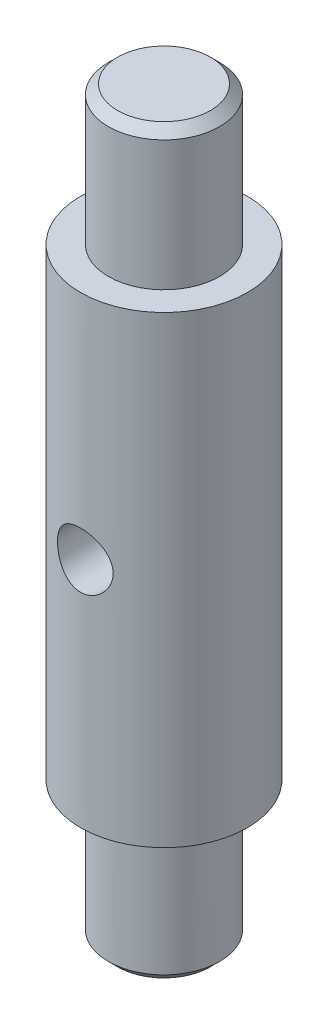
ISO-10303-21;
HEADER;
FILE_DESCRIPTION(('STEP AP214'),'2;1');
FILE_NAME('part.step','',(''),(''),'','','');
FILE_SCHEMA(('AUTOMOTIVE_DESIGN { 1 0 10303 214 1 1 1 1 }'));
ENDSEC;
DATA;
#1=APPLICATION_CONTEXT('core data for automotive mechanical design processes');
#2=APPLICATION_PROTOCOL_DEFINITION('international standard','automotive_design',2000,#1);
#3=PRODUCT_CONTEXT('',#1,'mechanical');
#4=PRODUCT('Part','Part','',(#3));
#5=PRODUCT_RELATED_PRODUCT_CATEGORY('part','',(#4));
#6=PRODUCT_DEFINITION_FORMATION('','',#4);
#7=PRODUCT_DEFINITION_CONTEXT('part definition',#1,'design');
#8=PRODUCT_DEFINITION('design','',#6,#7);
#9=PRODUCT_DEFINITION_SHAPE('','',#8);
#10=(LENGTH_UNIT() NAMED_UNIT(*) SI_UNIT(.MILLI.,.METRE.));
#11=(NAMED_UNIT(*) PLANE_ANGLE_UNIT() SI_UNIT($,.RADIAN.));
#12=(NAMED_UNIT(*) SI_UNIT($,.STERADIAN.) SOLID_ANGLE_UNIT());
#13=UNCERTAINTY_MEASURE_WITH_UNIT(LENGTH_MEASURE(1.E-05),#10,'distance_accuracy_value','');
#14=(GEOMETRIC_REPRESENTATION_CONTEXT(3) GLOBAL_UNCERTAINTY_ASSIGNED_CONTEXT((#13)) GLOBAL_UNIT_ASSIGNED_CONTEXT((#10,
#11,#12)) REPRESENTATION_CONTEXT('',''));
#15=CARTESIAN_POINT('',(0.,0.,0.));
#16=DIRECTION('',(0.,0.,1.));
#17=DIRECTION('',(1.,0.,0.));
#18=AXIS2_PLACEMENT_3D('',#15,#16,#17);
#19=CARTESIAN_POINT('',(6.,40.,-9.));
#20=DIRECTION('',(0.,0.,1.));
#21=DIRECTION('',(1.,0.,0.));
#22=AXIS2_PLACEMENT_3D('',#19,#20,#21);
#23=CYLINDRICAL_SURFACE('',#22,3.);
#24=CARTESIAN_POINT('',(6.,37.,9.));
#25=CARTESIAN_POINT('',(6.16369008866017,36.9999992388051,9.00000045902832));
#26=CARTESIAN_POINT('',(6.32737558361565,37.0134407983816,8.99549308522634));
#27=CARTESIAN_POINT('',(6.64992528261892,37.0666873264516,8.97795630609842));
#28=CARTESIAN_POINT('',(6.80878898435645,37.1064950318468,8.96492601606458));
#29=CARTESIAN_POINT('',(7.11699836850533,37.2109577301521,8.93175923719328));
#30=CARTESIAN_POINT('',(7.2663594776581,37.2755711873778,8.9116346319256));
#31=CARTESIAN_POINT('',(7.55212481041597,37.427623518515,8.86633337152026));
#32=CARTESIAN_POINT('',(7.68852647087612,37.5150668950078,8.84115572003334));
#33=CARTESIAN_POINT('',(7.9492250250668,37.7134774145763,8.78742283329015));
#34=CARTESIAN_POINT('',(8.07301110089492,37.8250937027815,8.75878669391355));
#35=CARTESIAN_POINT('',(8.30049807810625,38.0673014641197,8.70180944349365));
#36=CARTESIAN_POINT('',(8.40419455646838,38.1978971047855,8.67346839871647));
#37=CARTESIAN_POINT('',(8.59147482668358,38.4789553455894,8.61939997431822));
#38=CARTESIAN_POINT('',(8.6743945746631,38.6298812191964,8.59377117827064));
#39=CARTESIAN_POINT('',(8.81345662163316,38.9445282833756,8.54925916255803));
#40=CARTESIAN_POINT('',(8.8696070921603,39.1082455514882,8.53037388482237));
#41=CARTESIAN_POINT('',(8.95162038452749,39.4380196644901,8.50233909808132));
#42=CARTESIAN_POINT('',(8.97844034481531,39.6038116254672,8.49288287308834));
#43=CARTESIAN_POINT('',(9.00402337000343,39.9377912624676,8.48386969888523));
#44=CARTESIAN_POINT('',(9.00279510481416,40.1059781821276,8.4843096906819));
#45=CARTESIAN_POINT('',(8.97305971111026,40.4318098913321,8.49477045024541));
#46=CARTESIAN_POINT('',(8.94580173950099,40.5895852087571,8.50435247602599));
#47=CARTESIAN_POINT('',(8.86681848854825,40.8981802588205,8.53129973173653));
#48=CARTESIAN_POINT('',(8.81509027977562,41.0489991563052,8.54866589352323));
#49=CARTESIAN_POINT('',(8.68781717418064,41.3422382487744,8.58953733393746));
#50=CARTESIAN_POINT('',(8.61190214612179,41.4844840764086,8.61313697379352));
#51=CARTESIAN_POINT('',(8.43866731890942,41.7546127248392,8.66377675727179));
#52=CARTESIAN_POINT('',(8.34134133709202,41.8824913808001,8.69081789371391));
#53=CARTESIAN_POINT('',(8.12204799804671,42.1272747944823,8.74701987503223));
#54=CARTESIAN_POINT('',(7.99905945022893,42.2432580835272,8.77621768064529));
#55=CARTESIAN_POINT('',(7.73501870991019,42.4531937999902,8.8322081516111));
#56=CARTESIAN_POINT('',(7.59396478698245,42.5471441144935,8.85900058614202));
#57=CARTESIAN_POINT('',(7.29584283913881,42.7110889007052,8.90751323813381));
#58=CARTESIAN_POINT('',(7.13862982924901,42.7808364740222,8.92918050024118));
#59=CARTESIAN_POINT('',(6.81380725009352,42.8926095218671,8.96461701433305));
#60=CARTESIAN_POINT('',(6.64620131446486,42.9346446262703,8.97838900964638));
#61=CARTESIAN_POINT('',(6.31315148858791,42.9881669980671,8.99602881214321));
#62=CARTESIAN_POINT('',(6.14792879959454,43.0008994275183,9.00030005501184));
#63=CARTESIAN_POINT('',(5.81767479011929,42.9990019792046,8.99966708084482));
#64=CARTESIAN_POINT('',(5.65264344204105,42.9843767200604,8.99476441258087));
#65=CARTESIAN_POINT('',(5.33244040108723,42.9291642767921,8.97660074151313));
#66=CARTESIAN_POINT('',(5.17712157949547,42.8893413818515,8.96358596133577));
#67=CARTESIAN_POINT('',(4.87543212426128,42.7858196665998,8.9307554049021));
#68=CARTESIAN_POINT('',(4.72906263447418,42.7221178015966,8.91093876140025));
#69=CARTESIAN_POINT('',(4.44513511082018,42.5707887044776,8.86586793861869));
#70=CARTESIAN_POINT('',(4.30791012234856,42.4825762201505,8.84048444267358));
#71=CARTESIAN_POINT('',(4.04980550959324,42.2854175499596,8.78715761748787));
#72=CARTESIAN_POINT('',(3.92893089661327,42.1764650319047,8.75921350781483));
#73=CARTESIAN_POINT('',(3.7012424765811,41.9350637469802,8.70230543941334));
#74=CARTESIAN_POINT('',(3.59531709226269,41.8017723192194,8.67335283262284));
#75=CARTESIAN_POINT('',(3.40722743302928,41.5186852965673,8.61899919884126));
#76=CARTESIAN_POINT('',(3.32506335620696,41.3688895640978,8.59359820146007));
#77=CARTESIAN_POINT('',(3.18720920875091,41.0569809541303,8.54947175374151));
#78=CARTESIAN_POINT('',(3.13146560350493,40.8948937624937,8.53073282378937));
#79=CARTESIAN_POINT('',(3.04831599972193,40.5628640498676,8.50232496919349));
#80=CARTESIAN_POINT('',(3.02089723513818,40.392925103787,8.49265195870918));
#81=CARTESIAN_POINT('',(2.99617115256797,40.0594087118772,8.48393576622531));
#82=CARTESIAN_POINT('',(2.9973892280748,39.8959529791395,8.48437200772245));
#83=CARTESIAN_POINT('',(3.02627311965392,39.5717047752338,8.49453809471602));
#84=CARTESIAN_POINT('',(3.05393736162424,39.4109121461347,8.50426738708085));
#85=CARTESIAN_POINT('',(3.13388456061196,39.0995930109926,8.53153572914675));
#86=CARTESIAN_POINT('',(3.18568996195346,38.9489295249865,8.54892294067433));
#87=CARTESIAN_POINT('',(3.31206190272076,38.6583177791852,8.58949196455406));
#88=CARTESIAN_POINT('',(3.38663349433858,38.518371906436,8.61267506290179));
#89=CARTESIAN_POINT('',(3.56021792224971,38.2465489902313,8.66348487678139));
#90=CARTESIAN_POINT('',(3.66015527170626,38.1152904943048,8.69126134926411));
#91=CARTESIAN_POINT('',(3.88007135059305,37.8709305598474,8.74750068849759));
#92=CARTESIAN_POINT('',(4.00005574664555,37.7578342729358,8.77596374737117));
#93=CARTESIAN_POINT('',(4.26227532923793,37.5485667631325,8.83170091576633));
#94=CARTESIAN_POINT('',(4.40519545950082,37.453226956747,8.8588854540377));
#95=CARTESIAN_POINT('',(4.70592792778013,37.2880287134481,8.90777973517836));
#96=CARTESIAN_POINT('',(4.86373644560295,37.2181637622339,8.9294908772379));
#97=CARTESIAN_POINT('',(5.18251905839707,37.108835102534,8.96416545205626));
#98=CARTESIAN_POINT('',(5.34303672697078,37.0681526012099,8.97747637267568));
#99=CARTESIAN_POINT('',(5.66903875196926,37.0137391579686,8.99539221192665));
#100=CARTESIAN_POINT('',(5.83452172329376,37.0000007695104,8.99999953595715));
#101=CARTESIAN_POINT('',(6.,37.,9.));
#102=B_SPLINE_CURVE_WITH_KNOTS('',3,(#24,#25,#26,#27,#28,#29,#30,#31,#32,#33,#34,#35,#36,#37,
#38,#39,#40,#41,#42,#43,#44,#45,#46,#47,#48,#49,#50,#51,#52,#53,#54,#55,#56,#57,#58,#59,#60,#61,
#62,#63,#64,#65,#66,#67,#68,#69,#70,#71,#72,#73,#74,#75,#76,#77,#78,#79,#80,#81,#82,#83,#84,#85,
#86,#87,#88,#89,#90,#91,#92,#93,#94,#95,#96,#97,#98,#99,#100,#101),.UNSPECIFIED.,.T.,.F.,(4,2,2,
2,2,2,2,2,2,2,2,2,2,2,2,2,2,2,2,2,2,2,2,2,2,2,2,2,2,2,2,2,2,2,2,2,2,2,4),(0.,0.490461318078034,
0.980973555802562,1.47066801861082,1.9604591333973,2.46554052848268,2.97073299862591,
3.49045154470411,4.010011340785,4.5120577722552,5.01394901962457,5.49290479653841,
5.97191792566446,6.45864513465392,6.94551307674622,7.45779917434101,7.97013437899855,
8.48755216951073,9.00479006631625,9.49960749525509,9.9943413949253,10.4747447393464,
10.9552093585231,11.4483119953121,11.9415654246567,12.4572306864226,12.9729002470499,
13.4875204148031,14.0019085411752,14.4898699819278,14.9778023805413,15.4564676124125,
15.9352391452793,16.4349020007541,16.9347063337134,17.453989825053,17.9731404345737,
18.4690967512144,18.9649159811442),.UNSPECIFIED.);
#103=CARTESIAN_POINT('',(6.,37.,9.));
#104=VERTEX_POINT('',#103);
#105=EDGE_CURVE('E139',#104,#104,#102,.T.);
#106=ORIENTED_EDGE('',*,*,#105,.T.);
#107=EDGE_LOOP('',(#106));
#108=FACE_BOUND('',#107,.T.);
#109=CARTESIAN_POINT('',(6.,40.,0.));
#110=DIRECTION('',(0.,0.707106781186547,0.707106781186548));
#111=DIRECTION('',(0.,-0.707106781186547,0.707106781186548));
#112=AXIS2_PLACEMENT_3D('',#109,#110,#111);
#113=ELLIPSE('',#112,4.24264068711929,3.);
#114=CARTESIAN_POINT('',(9.,40.,0.));
#115=VERTEX_POINT('',#114);
#116=CARTESIAN_POINT('',(3.,40.,0.));
#117=VERTEX_POINT('',#116);
#118=EDGE_CURVE('E61',#115,#117,#113,.F.);
#119=ORIENTED_EDGE('',*,*,#118,.T.);
#120=CARTESIAN_POINT('',(6.,40.,0.));
#121=DIRECTION('',(0.,-0.707106781186547,0.707106781186548));
#122=DIRECTION('',(0.,0.707106781186547,0.707106781186548));
#123=AXIS2_PLACEMENT_3D('',#120,#121,#122);
#124=ELLIPSE('',#123,4.24264068711929,3.);
#125=EDGE_CURVE('E69',#117,#115,#124,.F.);
#126=ORIENTED_EDGE('',*,*,#125,.T.);
#127=EDGE_LOOP('',(#119,#126));
#128=FACE_BOUND('',#127,.T.);
#129=ADVANCED_FACE('F46',(#108,#128),#23,.F.);
#130=CARTESIAN_POINT('',(0.,0.,0.));
#131=DIRECTION('',(0.,-1.,0.));
#132=DIRECTION('',(0.,0.,-1.));
#133=AXIS2_PLACEMENT_3D('',#130,#131,#132);
#134=PLANE('',#133);
#135=CARTESIAN_POINT('',(6.,0.,0.));
#136=DIRECTION('',(0.,-1.,0.));
#137=DIRECTION('',(0.,0.,-1.));
#138=AXIS2_PLACEMENT_3D('',#135,#136,#137);
#139=CIRCLE('',#138,5.);
#140=CARTESIAN_POINT('',(6.,0.,-5.));
#141=VERTEX_POINT('',#140);
#142=EDGE_CURVE('E11',#141,#141,#139,.T.);
#143=ORIENTED_EDGE('',*,*,#142,.T.);
#144=EDGE_LOOP('',(#143));
#145=FACE_BOUND('',#144,.T.);
#146=CARTESIAN_POINT('',(6.,0.,0.));
#147=DIRECTION('',(0.,-1.,0.));
#148=DIRECTION('',(0.,0.,-1.));
#149=AXIS2_PLACEMENT_3D('',#146,#147,#148);
#150=CIRCLE('',#149,3.);
#151=CARTESIAN_POINT('',(6.,0.,-3.));
#152=VERTEX_POINT('',#151);
#153=EDGE_CURVE('E166',#152,#152,#150,.T.);
#154=ORIENTED_EDGE('',*,*,#153,.F.);
#155=EDGE_LOOP('',(#154));
#156=FACE_BOUND('',#155,.T.);
#157=ADVANCED_FACE('F104',(#145,#156),#134,.T.);
#158=CARTESIAN_POINT('',(0.,80.,0.));
#159=DIRECTION('',(0.,1.,0.));
#160=DIRECTION('',(0.,0.,1.));
#161=AXIS2_PLACEMENT_3D('',#158,#159,#160);
#162=PLANE('',#161);
#163=CARTESIAN_POINT('',(6.,80.,0.));
#164=DIRECTION('',(0.,1.,0.));
#165=DIRECTION('',(0.,0.,1.));
#166=AXIS2_PLACEMENT_3D('',#163,#164,#165);
#167=CIRCLE('',#166,5.);
#168=CARTESIAN_POINT('',(6.,80.,5.));
#169=VERTEX_POINT('',#168);
#170=EDGE_CURVE('E78',#169,#169,#167,.T.);
#171=ORIENTED_EDGE('',*,*,#170,.T.);
#172=EDGE_LOOP('',(#171));
#173=FACE_BOUND('',#172,.T.);
#174=ADVANCED_FACE('F110',(#173),#162,.T.);
#175=CARTESIAN_POINT('',(6.,80.,0.));
#176=DIRECTION('',(0.,1.,0.));
#177=DIRECTION('',(0.,0.,1.));
#178=AXIS2_PLACEMENT_3D('',#175,#176,#177);
#179=CYLINDRICAL_SURFACE('',#178,6.);
#180=CARTESIAN_POINT('',(6.,79.,0.));
#181=DIRECTION('',(0.,1.,0.));
#182=DIRECTION('',(0.,0.,1.));
#183=AXIS2_PLACEMENT_3D('',#180,#181,#182);
#184=CIRCLE('',#183,6.);
#185=CARTESIAN_POINT('',(6.,79.,6.));
#186=VERTEX_POINT('',#185);
#187=EDGE_CURVE('E86',#186,#186,#184,.F.);
#188=ORIENTED_EDGE('',*,*,#187,.T.);
#189=EDGE_LOOP('',(#188));
#190=FACE_BOUND('',#189,.T.);
#191=CARTESIAN_POINT('',(6.,65.,0.));
#192=DIRECTION('',(0.,1.,0.));
#193=DIRECTION('',(0.,0.,1.));
#194=AXIS2_PLACEMENT_3D('',#191,#192,#193);
#195=CIRCLE('',#194,6.);
#196=CARTESIAN_POINT('',(6.,65.,6.));
#197=VERTEX_POINT('',#196);
#198=EDGE_CURVE('E150',#197,#197,#195,.T.);
#199=ORIENTED_EDGE('',*,*,#198,.T.);
#200=EDGE_LOOP('',(#199));
#201=FACE_BOUND('',#200,.T.);
#202=ADVANCED_FACE('F247',(#190,#201),#179,.T.);
#203=CARTESIAN_POINT('',(-3.,65.,0.));
#204=DIRECTION('',(0.,1.,0.));
#205=DIRECTION('',(0.,0.,1.));
#206=AXIS2_PLACEMENT_3D('',#203,#204,#205);
#207=PLANE('',#206);
#208=CARTESIAN_POINT('',(6.,65.,0.));
#209=DIRECTION('',(0.,1.,0.));
#210=DIRECTION('',(0.,0.,1.));
#211=AXIS2_PLACEMENT_3D('',#208,#209,#210);
#212=CIRCLE('',#211,9.);
#213=CARTESIAN_POINT('',(6.,65.,9.));
#214=VERTEX_POINT('',#213);
#215=EDGE_CURVE('E153',#214,#214,#212,.T.);
#216=ORIENTED_EDGE('',*,*,#215,.T.);
#217=EDGE_LOOP('',(#216));
#218=FACE_BOUND('',#217,.T.);
#219=ORIENTED_EDGE('',*,*,#198,.F.);
#220=EDGE_LOOP('',(#219));
#221=FACE_BOUND('',#220,.T.);
#222=ADVANCED_FACE('F134',(#218,#221),#207,.T.);
#223=CARTESIAN_POINT('',(6.,80.,0.));
#224=DIRECTION('',(0.,1.,0.));
#225=DIRECTION('',(0.,0.,1.));
#226=AXIS2_PLACEMENT_3D('',#223,#224,#225);
#227=CYLINDRICAL_SURFACE('',#226,9.);
#228=CARTESIAN_POINT('',(6.,43.,-9.));
#229=CARTESIAN_POINT('',(6.16369008866017,43.0000007611949,-9.00000045902832));
#230=CARTESIAN_POINT('',(6.32737558361565,42.9865592016184,-8.99549308522634));
#231=CARTESIAN_POINT('',(6.64992528261892,42.9333126735484,-8.97795630609842));
#232=CARTESIAN_POINT('',(6.80878898435645,42.8935049681532,-8.96492601606458));
#233=CARTESIAN_POINT('',(7.11699836850533,42.7890422698479,-8.93175923719328));
#234=CARTESIAN_POINT('',(7.2663594776581,42.7244288126222,-8.9116346319256));
#235=CARTESIAN_POINT('',(7.55212481041597,42.572376481485,-8.86633337152026));
#236=CARTESIAN_POINT('',(7.68852647087612,42.4849331049922,-8.84115572003334));
#237=CARTESIAN_POINT('',(7.9492250250668,42.2865225854237,-8.78742283329015));
#238=CARTESIAN_POINT('',(8.07301110089492,42.1749062972185,-8.75878669391355));
#239=CARTESIAN_POINT('',(8.30049807810625,41.9326985358803,-8.70180944349365));
#240=CARTESIAN_POINT('',(8.40419455646838,41.8021028952145,-8.67346839871647));
#241=CARTESIAN_POINT('',(8.59147482668358,41.5210446544106,-8.61939997431822));
#242=CARTESIAN_POINT('',(8.6743945746631,41.3701187808036,-8.59377117827064));
#243=CARTESIAN_POINT('',(8.81345662163316,41.0554717166244,-8.54925916255803));
#244=CARTESIAN_POINT('',(8.8696070921603,40.8917544485118,-8.53037388482237));
#245=CARTESIAN_POINT('',(8.95162038452749,40.5619803355099,-8.50233909808132));
#246=CARTESIAN_POINT('',(8.97844034481531,40.3961883745328,-8.49288287308834));
#247=CARTESIAN_POINT('',(9.00402337000343,40.0622087375324,-8.48386969888523));
#248=CARTESIAN_POINT('',(9.00279510481416,39.8940218178724,-8.4843096906819));
#249=CARTESIAN_POINT('',(8.97305971111026,39.5681901086679,-8.49477045024541));
#250=CARTESIAN_POINT('',(8.94580173950099,39.4104147912429,-8.50435247602599));
#251=CARTESIAN_POINT('',(8.86681848854825,39.1018197411795,-8.53129973173653));
#252=CARTESIAN_POINT('',(8.81509027977562,38.9510008436948,-8.54866589352323));
#253=CARTESIAN_POINT('',(8.68781717418064,38.6577617512256,-8.58953733393746));
#254=CARTESIAN_POINT('',(8.61190214612179,38.5155159235914,-8.61313697379352));
#255=CARTESIAN_POINT('',(8.43866731890942,38.2453872751608,-8.66377675727179));
#256=CARTESIAN_POINT('',(8.34134133709202,38.1175086191999,-8.69081789371391));
#257=CARTESIAN_POINT('',(8.12204799804671,37.8727252055177,-8.74701987503223));
#258=CARTESIAN_POINT('',(7.99905945022893,37.7567419164728,-8.77621768064529));
#259=CARTESIAN_POINT('',(7.73501870991019,37.5468062000098,-8.8322081516111));
#260=CARTESIAN_POINT('',(7.59396478698245,37.4528558855065,-8.85900058614202));
#261=CARTESIAN_POINT('',(7.29584283913881,37.2889110992948,-8.90751323813381));
#262=CARTESIAN_POINT('',(7.13862982924902,37.2191635259778,-8.92918050024118));
#263=CARTESIAN_POINT('',(6.81380725009353,37.1073904781329,-8.96461701433304));
#264=CARTESIAN_POINT('',(6.64620131446487,37.0653553737297,-8.97838900964638));
#265=CARTESIAN_POINT('',(6.31315148858791,37.0118330019329,-8.99602881214321));
#266=CARTESIAN_POINT('',(6.14792879959454,36.9991005724817,-9.00030005501184));
#267=CARTESIAN_POINT('',(5.81767479011929,37.0009980207954,-8.99966708084482));
#268=CARTESIAN_POINT('',(5.65264344204105,37.0156232799396,-8.99476441258087));
#269=CARTESIAN_POINT('',(5.33244040108723,37.0708357232079,-8.97660074151313));
#270=CARTESIAN_POINT('',(5.17712157949547,37.1106586181485,-8.96358596133577));
#271=CARTESIAN_POINT('',(4.87543212426128,37.2141803334002,-8.9307554049021));
#272=CARTESIAN_POINT('',(4.72906263447418,37.2778821984034,-8.91093876140025));
#273=CARTESIAN_POINT('',(4.44513511082018,37.4292112955224,-8.86586793861869));
#274=CARTESIAN_POINT('',(4.30791012234856,37.5174237798495,-8.84048444267358));
#275=CARTESIAN_POINT('',(4.04980550959324,37.7145824500404,-8.78715761748787));
#276=CARTESIAN_POINT('',(3.92893089661327,37.8235349680953,-8.75921350781483));
#277=CARTESIAN_POINT('',(3.7012424765811,38.0649362530198,-8.70230543941334));
#278=CARTESIAN_POINT('',(3.59531709226269,38.1982276807806,-8.67335283262284));
#279=CARTESIAN_POINT('',(3.40722743302928,38.4813147034327,-8.61899919884126));
#280=CARTESIAN_POINT('',(3.32506335620696,38.6311104359022,-8.59359820146007));
#281=CARTESIAN_POINT('',(3.18720920875091,38.9430190458697,-8.54947175374151));
#282=CARTESIAN_POINT('',(3.13146560350493,39.1051062375063,-8.53073282378937));
#283=CARTESIAN_POINT('',(3.04831599972193,39.4371359501324,-8.50232496919349));
#284=CARTESIAN_POINT('',(3.02089723513818,39.607074896213,-8.49265195870918));
#285=CARTESIAN_POINT('',(2.99617115256797,39.9405912881227,-8.48393576622531));
#286=CARTESIAN_POINT('',(2.9973892280748,40.1040470208605,-8.48437200772245));
#287=CARTESIAN_POINT('',(3.02627311965392,40.4282952247662,-8.49453809471602));
#288=CARTESIAN_POINT('',(3.05393736162424,40.5890878538653,-8.50426738708085));
#289=CARTESIAN_POINT('',(3.13388456061196,40.9004069890074,-8.53153572914675));
#290=CARTESIAN_POINT('',(3.18568996195346,41.0510704750135,-8.54892294067433));
#291=CARTESIAN_POINT('',(3.31206190272076,41.3416822208148,-8.58949196455406));
#292=CARTESIAN_POINT('',(3.38663349433858,41.481628093564,-8.61267506290179));
#293=CARTESIAN_POINT('',(3.56021792224971,41.7534510097687,-8.66348487678139));
#294=CARTESIAN_POINT('',(3.66015527170626,41.8847095056952,-8.69126134926411));
#295=CARTESIAN_POINT('',(3.88007135059305,42.1290694401526,-8.74750068849759));
#296=CARTESIAN_POINT('',(4.00005574664555,42.2421657270642,-8.77596374737117));
#297=CARTESIAN_POINT('',(4.26227532923794,42.4514332368675,-8.83170091576633));
#298=CARTESIAN_POINT('',(4.40519545950082,42.546773043253,-8.8588854540377));
#299=CARTESIAN_POINT('',(4.70592792778013,42.711971286552,-8.90777973517836));
#300=CARTESIAN_POINT('',(4.86373644560296,42.7818362377661,-8.9294908772379));
#301=CARTESIAN_POINT('',(5.18251905839707,42.891164897466,-8.96416545205626));
#302=CARTESIAN_POINT('',(5.34303672697078,42.9318473987901,-8.97747637267568));
#303=CARTESIAN_POINT('',(5.66903875196926,42.9862608420314,-8.99539221192665));
#304=CARTESIAN_POINT('',(5.83452172329376,42.9999992304896,-8.99999953595715));
#305=CARTESIAN_POINT('',(6.,43.,-9.));
#306=B_SPLINE_CURVE_WITH_KNOTS('',3,(#228,#229,#230,#231,#232,#233,#234,#235,#236,#237,#238,
#239,#240,#241,#242,#243,#244,#245,#246,#247,#248,#249,#250,#251,#252,#253,#254,#255,#256,#257,
#258,#259,#260,#261,#262,#263,#264,#265,#266,#267,#268,#269,#270,#271,#272,#273,#274,#275,#276,
#277,#278,#279,#280,#281,#282,#283,#284,#285,#286,#287,#288,#289,#290,#291,#292,#293,#294,#295,
#296,#297,#298,#299,#300,#301,#302,#303,#304,#305),.UNSPECIFIED.,.T.,.F.,(4,2,2,2,2,2,2,2,2,2,2,
2,2,2,2,2,2,2,2,2,2,2,2,2,2,2,2,2,2,2,2,2,2,2,2,2,2,2,4),(0.,0.490461318078034,
0.980973555802562,1.47066801861082,1.9604591333973,2.46554052848268,2.97073299862591,
3.49045154470411,4.010011340785,4.51205777225521,5.01394901962457,5.49290479653841,
5.97191792566446,6.45864513465392,6.94551307674622,7.45779917434101,7.97013437899855,
8.48755216951072,9.00479006631625,9.49960749525509,9.9943413949253,10.4747447393464,
10.9552093585231,11.4483119953121,11.9415654246567,12.4572306864226,12.9729002470499,
13.4875204148031,14.0019085411752,14.4898699819277,14.9778023805413,15.4564676124125,
15.9352391452793,16.4349020007541,16.9347063337134,17.453989825053,17.9731404345737,
18.4690967512144,18.9649159811442),.UNSPECIFIED.);
#307=CARTESIAN_POINT('',(6.,43.,-9.));
#308=VERTEX_POINT('',#307);
#309=EDGE_CURVE('E76',#308,#308,#306,.T.);
#310=ORIENTED_EDGE('',*,*,#309,.F.);
#311=EDGE_LOOP('',(#310));
#312=FACE_BOUND('',#311,.T.);
#313=ORIENTED_EDGE('',*,*,#105,.F.);
#314=EDGE_LOOP('',(#313));
#315=FACE_BOUND('',#314,.T.);
#316=CARTESIAN_POINT('',(6.,15.,0.));
#317=DIRECTION('',(0.,1.,0.));
#318=DIRECTION('',(0.,0.,1.));
#319=AXIS2_PLACEMENT_3D('',#316,#317,#318);
#320=CIRCLE('',#319,9.);
#321=CARTESIAN_POINT('',(6.,15.,9.));
#322=VERTEX_POINT('',#321);
#323=EDGE_CURVE('E157',#322,#322,#320,.T.);
#324=ORIENTED_EDGE('',*,*,#323,.T.);
#325=EDGE_LOOP('',(#324));
#326=FACE_BOUND('',#325,.T.);
#327=ORIENTED_EDGE('',*,*,#215,.F.);
#328=EDGE_LOOP('',(#327));
#329=FACE_BOUND('',#328,.T.);
#330=ADVANCED_FACE('F127',(#312,#315,#326,#329),#227,.T.);
#331=CARTESIAN_POINT('',(0.,15.,0.));
#332=DIRECTION('',(0.,-1.,0.));
#333=DIRECTION('',(0.,0.,-1.));
#334=AXIS2_PLACEMENT_3D('',#331,#332,#333);
#335=PLANE('',#334);
#336=CARTESIAN_POINT('',(6.,15.,0.));
#337=DIRECTION('',(0.,1.,0.));
#338=DIRECTION('',(0.,0.,1.));
#339=AXIS2_PLACEMENT_3D('',#336,#337,#338);
#340=CIRCLE('',#339,6.);
#341=CARTESIAN_POINT('',(6.,15.,6.));
#342=VERTEX_POINT('',#341);
#343=EDGE_CURVE('E162',#342,#342,#340,.T.);
#344=ORIENTED_EDGE('',*,*,#343,.T.);
#345=EDGE_LOOP('',(#344));
#346=FACE_BOUND('',#345,.T.);
#347=ORIENTED_EDGE('',*,*,#323,.F.);
#348=EDGE_LOOP('',(#347));
#349=FACE_BOUND('',#348,.T.);
#350=ADVANCED_FACE('F123',(#346,#349),#335,.T.);
#351=CARTESIAN_POINT('',(6.,80.,0.));
#352=DIRECTION('',(0.,1.,0.));
#353=DIRECTION('',(0.,0.,1.));
#354=AXIS2_PLACEMENT_3D('',#351,#352,#353);
#355=CYLINDRICAL_SURFACE('',#354,6.);
#356=CARTESIAN_POINT('',(6.,1.,0.));
#357=DIRECTION('',(0.,-1.,0.));
#358=DIRECTION('',(0.,0.,-1.));
#359=AXIS2_PLACEMENT_3D('',#356,#357,#358);
#360=CIRCLE('',#359,6.);
#361=CARTESIAN_POINT('',(6.,1.,-6.));
#362=VERTEX_POINT('',#361);
#363=EDGE_CURVE('E55',#362,#362,#360,.F.);
#364=ORIENTED_EDGE('',*,*,#363,.T.);
#365=EDGE_LOOP('',(#364));
#366=FACE_BOUND('',#365,.T.);
#367=ORIENTED_EDGE('',*,*,#343,.F.);
#368=EDGE_LOOP('',(#367));
#369=FACE_BOUND('',#368,.T.);
#370=ADVANCED_FACE('F91',(#366,#369),#355,.T.);
#371=CARTESIAN_POINT('',(6.,40.,0.));
#372=DIRECTION('',(0.,0.707106781186547,0.707106781186548));
#373=DIRECTION('',(0.,-0.707106781186547,0.707106781186548));
#374=AXIS2_PLACEMENT_3D('',#371,#372,#373);
#375=ELLIPSE('',#374,4.24264068711929,3.);
#376=EDGE_CURVE('E67',#115,#117,#375,.T.);
#377=ORIENTED_EDGE('',*,*,#376,.T.);
#378=CARTESIAN_POINT('',(6.,40.,0.));
#379=DIRECTION('',(0.,-0.707106781186547,0.707106781186548));
#380=DIRECTION('',(0.,0.707106781186547,0.707106781186548));
#381=AXIS2_PLACEMENT_3D('',#378,#379,#380);
#382=ELLIPSE('',#381,4.24264068711929,3.);
#383=EDGE_CURVE('E72',#117,#115,#382,.T.);
#384=ORIENTED_EDGE('',*,*,#383,.T.);
#385=EDGE_LOOP('',(#377,#384));
#386=FACE_BOUND('',#385,.T.);
#387=ORIENTED_EDGE('',*,*,#309,.T.);
#388=EDGE_LOOP('',(#387));
#389=FACE_BOUND('',#388,.T.);
#390=ADVANCED_FACE('F80',(#386,#389),#23,.F.);
#391=CARTESIAN_POINT('',(6.,45.,0.));
#392=DIRECTION('',(0.,-1.,0.));
#393=DIRECTION('',(0.,0.,-1.));
#394=AXIS2_PLACEMENT_3D('',#391,#392,#393);
#395=CYLINDRICAL_SURFACE('',#394,3.);
#396=ORIENTED_EDGE('',*,*,#153,.T.);
#397=EDGE_LOOP('',(#396));
#398=FACE_BOUND('',#397,.T.);
#399=ORIENTED_EDGE('',*,*,#118,.F.);
#400=ORIENTED_EDGE('',*,*,#383,.F.);
#401=EDGE_LOOP('',(#399,#400));
#402=FACE_BOUND('',#401,.T.);
#403=ADVANCED_FACE('F75',(#398,#402),#395,.F.);
#404=CARTESIAN_POINT('',(6.,45.,0.));
#405=DIRECTION('',(0.,-1.,0.));
#406=DIRECTION('',(0.,0.,-1.));
#407=AXIS2_PLACEMENT_3D('',#404,#405,#406);
#408=CIRCLE('',#407,3.);
#409=CARTESIAN_POINT('',(6.,45.,-3.));
#410=VERTEX_POINT('',#409);
#411=EDGE_CURVE('E165',#410,#410,#408,.T.);
#412=ORIENTED_EDGE('',*,*,#411,.F.);
#413=EDGE_LOOP('',(#412));
#414=FACE_BOUND('',#413,.T.);
#415=ORIENTED_EDGE('',*,*,#376,.F.);
#416=ORIENTED_EDGE('',*,*,#125,.F.);
#417=EDGE_LOOP('',(#415,#416));
#418=FACE_BOUND('',#417,.T.);
#419=ADVANCED_FACE('F68',(#414,#418),#395,.F.);
#420=CARTESIAN_POINT('',(6.,45.,0.));
#421=DIRECTION('',(0.,-1.,0.));
#422=DIRECTION('',(0.,0.,-1.));
#423=AXIS2_PLACEMENT_3D('',#420,#421,#422);
#424=PLANE('',#423);
#425=ORIENTED_EDGE('',*,*,#411,.T.);
#426=EDGE_LOOP('',(#425));
#427=FACE_BOUND('',#426,.T.);
#428=ADVANCED_FACE('F100',(#427),#424,.T.);
#429=CARTESIAN_POINT('',(6.,80.,0.));
#430=DIRECTION('',(0.,-1.,0.));
#431=DIRECTION('',(0.,0.,-1.));
#432=AXIS2_PLACEMENT_3D('',#429,#430,#431);
#433=CONICAL_SURFACE('',#432,5.,0.785398163397453);
#434=ORIENTED_EDGE('',*,*,#187,.F.);
#435=EDGE_LOOP('',(#434));
#436=FACE_BOUND('',#435,.T.);
#437=ORIENTED_EDGE('',*,*,#170,.F.);
#438=EDGE_LOOP('',(#437));
#439=FACE_BOUND('',#438,.T.);
#440=ADVANCED_FACE('F95',(#436,#439),#433,.T.);
#441=CARTESIAN_POINT('',(6.,1.,0.));
#442=DIRECTION('',(0.,1.,0.));
#443=DIRECTION('',(0.,0.,1.));
#444=AXIS2_PLACEMENT_3D('',#441,#442,#443);
#445=CONICAL_SURFACE('',#444,6.,0.785398163397449);
#446=ORIENTED_EDGE('',*,*,#142,.F.);
#447=EDGE_LOOP('',(#446));
#448=FACE_BOUND('',#447,.T.);
#449=ORIENTED_EDGE('',*,*,#363,.F.);
#450=EDGE_LOOP('',(#449));
#451=FACE_BOUND('',#450,.T.);
#452=ADVANCED_FACE('F49',(#448,#451),#445,.T.);
#453=CLOSED_SHELL('',(#129,#157,#174,#202,#222,#330,#350,#370,#390,#403,#419,#428,#440,#452));
#454=MANIFOLD_SOLID_BREP('B2',#453);
#455=ADVANCED_BREP_SHAPE_REPRESENTATION('',(#18,#454),#14);
#456=SHAPE_DEFINITION_REPRESENTATION(#9,#455);
ENDSEC;
END-ISO-10303-21;
